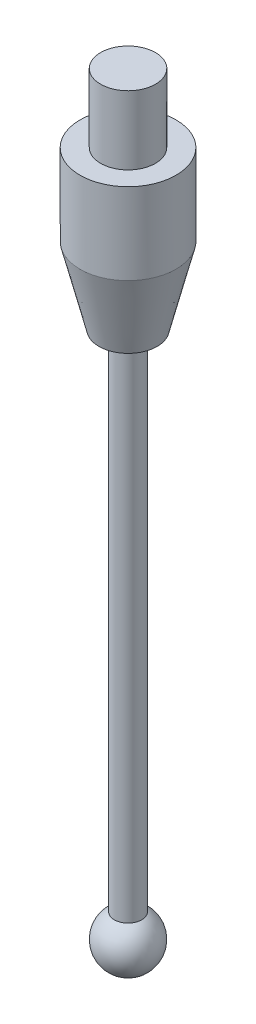
ISO-10303-21;
HEADER;
FILE_DESCRIPTION(('STEP AP214'),'2;1');
FILE_NAME('part.step','',(''),(''),'','','');
FILE_SCHEMA(('AUTOMOTIVE_DESIGN { 1 0 10303 214 1 1 1 1 }'));
ENDSEC;
DATA;
#1=APPLICATION_CONTEXT('core data for automotive mechanical design processes');
#2=APPLICATION_PROTOCOL_DEFINITION('international standard','automotive_design',2000,#1);
#3=PRODUCT_CONTEXT('',#1,'mechanical');
#4=PRODUCT('Part','Part','',(#3));
#5=PRODUCT_RELATED_PRODUCT_CATEGORY('part','',(#4));
#6=PRODUCT_DEFINITION_FORMATION('','',#4);
#7=PRODUCT_DEFINITION_CONTEXT('part definition',#1,'design');
#8=PRODUCT_DEFINITION('design','',#6,#7);
#9=PRODUCT_DEFINITION_SHAPE('','',#8);
#10=(LENGTH_UNIT() NAMED_UNIT(*) SI_UNIT(.MILLI.,.METRE.));
#11=(NAMED_UNIT(*) PLANE_ANGLE_UNIT() SI_UNIT($,.RADIAN.));
#12=(NAMED_UNIT(*) SI_UNIT($,.STERADIAN.) SOLID_ANGLE_UNIT());
#13=UNCERTAINTY_MEASURE_WITH_UNIT(LENGTH_MEASURE(1.E-05),#10,'distance_accuracy_value','');
#14=(GEOMETRIC_REPRESENTATION_CONTEXT(3) GLOBAL_UNCERTAINTY_ASSIGNED_CONTEXT((#13)) GLOBAL_UNIT_ASSIGNED_CONTEXT((#10,
#11,#12)) REPRESENTATION_CONTEXT('',''));
#15=CARTESIAN_POINT('',(0.,0.,0.));
#16=DIRECTION('',(0.,0.,1.));
#17=DIRECTION('',(1.,0.,0.));
#18=AXIS2_PLACEMENT_3D('',#15,#16,#17);
#19=CARTESIAN_POINT('',(0.,0.,0.));
#20=DIRECTION('',(0.,-0.999999999999997,0.));
#21=DIRECTION('',(-1.,0.,0.));
#22=AXIS2_PLACEMENT_3D('',#19,#20,#21);
#23=SPHERICAL_SURFACE('',#22,2.);
#24=CARTESIAN_POINT('',(0.,1.73205080756887,0.));
#25=DIRECTION('',(0.,-0.999999999999997,0.));
#26=DIRECTION('',(0.,0.,-1.));
#27=AXIS2_PLACEMENT_3D('',#24,#25,#26);
#28=CIRCLE('',#27,1.);
#29=CARTESIAN_POINT('',(0.,1.73205080756887,-1.));
#30=VERTEX_POINT('',#29);
#31=EDGE_CURVE('E37',#30,#30,#28,.T.);
#32=ORIENTED_EDGE('',*,*,#31,.T.);
#33=EDGE_LOOP('',(#32));
#34=FACE_BOUND('',#33,.T.);
#35=ADVANCED_FACE('F34',(#34),#23,.T.);
#36=CARTESIAN_POINT('',(0.,-2.,0.));
#37=DIRECTION('',(0.,-0.999999999999997,0.));
#38=DIRECTION('',(0.,0.,-1.));
#39=AXIS2_PLACEMENT_3D('',#36,#37,#38);
#40=CYLINDRICAL_SURFACE('',#39,1.);
#41=CARTESIAN_POINT('',(0.,38.4999999999998,0.));
#42=DIRECTION('',(0.,-0.999999999999997,0.));
#43=DIRECTION('',(0.,0.,-1.));
#44=AXIS2_PLACEMENT_3D('',#41,#42,#43);
#45=CIRCLE('',#44,1.);
#46=CARTESIAN_POINT('',(0.,38.4999999999998,-1.));
#47=VERTEX_POINT('',#46);
#48=EDGE_CURVE('E45',#47,#47,#45,.T.);
#49=CARTESIAN_POINT('',(0.,38.4999999999998,-1.));
#50=CARTESIAN_POINT('',(0.,38.1170005292454,-1.));
#51=CARTESIAN_POINT('',(0.,37.7340010584909,-1.));
#52=CARTESIAN_POINT('',(0.,36.9680021169819,-1.));
#53=CARTESIAN_POINT('',(0.,36.5850026462274,-1.));
#54=CARTESIAN_POINT('',(0.,35.8190037047184,-1.));
#55=CARTESIAN_POINT('',(0.,35.4360042339639,-1.));
#56=CARTESIAN_POINT('',(0.,34.6700052924549,-1.));
#57=CARTESIAN_POINT('',(0.,34.2870058217005,-1.));
#58=CARTESIAN_POINT('',(0.,33.5210068801915,-1.));
#59=CARTESIAN_POINT('',(0.,33.138007409437,-1.));
#60=CARTESIAN_POINT('',(0.,32.372008467928,-1.));
#61=CARTESIAN_POINT('',(0.,31.9890089971735,-1.));
#62=CARTESIAN_POINT('',(0.,31.2230100556645,-1.));
#63=CARTESIAN_POINT('',(0.,30.8400105849101,-1.));
#64=CARTESIAN_POINT('',(0.,30.0740116434011,-1.));
#65=CARTESIAN_POINT('',(0.,29.6910121726466,-1.));
#66=CARTESIAN_POINT('',(0.,28.9250132311376,-1.));
#67=CARTESIAN_POINT('',(0.,28.5420137603831,-1.));
#68=CARTESIAN_POINT('',(0.,27.7760148188741,-1.));
#69=CARTESIAN_POINT('',(0.,27.3930153481197,-1.));
#70=CARTESIAN_POINT('',(0.,26.6270164066107,-1.));
#71=CARTESIAN_POINT('',(0.,26.2440169358562,-1.));
#72=CARTESIAN_POINT('',(0.,25.4780179943472,-1.));
#73=CARTESIAN_POINT('',(0.,25.0950185235927,-1.));
#74=CARTESIAN_POINT('',(0.,24.3290195820837,-1.));
#75=CARTESIAN_POINT('',(0.,23.9460201113293,-1.));
#76=CARTESIAN_POINT('',(0.,23.1800211698203,-1.));
#77=CARTESIAN_POINT('',(0.,22.7970216990658,-1.));
#78=CARTESIAN_POINT('',(0.,22.0310227575568,-1.));
#79=CARTESIAN_POINT('',(0.,21.6480232868023,-1.));
#80=CARTESIAN_POINT('',(0.,20.8820243452933,-1.));
#81=CARTESIAN_POINT('',(0.,20.4990248745388,-1.));
#82=CARTESIAN_POINT('',(0.,19.7330259330299,-1.));
#83=CARTESIAN_POINT('',(0.,19.3500264622754,-1.));
#84=CARTESIAN_POINT('',(0.,18.5840275207664,-1.));
#85=CARTESIAN_POINT('',(0.,18.2010280500119,-1.));
#86=CARTESIAN_POINT('',(0.,17.4350291085029,-1.));
#87=CARTESIAN_POINT('',(0.,17.0520296377484,-1.));
#88=CARTESIAN_POINT('',(0.,16.2860306962395,-1.));
#89=CARTESIAN_POINT('',(0.,15.903031225485,-1.));
#90=CARTESIAN_POINT('',(0.,15.137032283976,-1.));
#91=CARTESIAN_POINT('',(0.,14.7540328132215,-1.));
#92=CARTESIAN_POINT('',(0.,13.9880338717125,-1.));
#93=CARTESIAN_POINT('',(0.,13.605034400958,-1.));
#94=CARTESIAN_POINT('',(0.,12.8390354594491,-1.));
#95=CARTESIAN_POINT('',(0.,12.4560359886946,-1.));
#96=CARTESIAN_POINT('',(0.,11.6900370471856,-1.));
#97=CARTESIAN_POINT('',(0.,11.3070375764311,-1.));
#98=CARTESIAN_POINT('',(0.,10.5410386349221,-1.));
#99=CARTESIAN_POINT('',(0.,10.1580391641676,-1.));
#100=CARTESIAN_POINT('',(0.,9.39204022265866,-1.));
#101=CARTESIAN_POINT('',(0.,9.00904075190417,-1.));
#102=CARTESIAN_POINT('',(0.,8.24304181039519,-1.));
#103=CARTESIAN_POINT('',(0.,7.8600423396407,-1.));
#104=CARTESIAN_POINT('',(0.,7.09404339813173,-1.));
#105=CARTESIAN_POINT('',(0.,6.71104392737724,-1.));
#106=CARTESIAN_POINT('',(0.,5.94504498586826,-1.));
#107=CARTESIAN_POINT('',(0.,5.56204551511377,-1.));
#108=CARTESIAN_POINT('',(0.,4.79604657360479,-1.));
#109=CARTESIAN_POINT('',(0.,4.4130471028503,-1.));
#110=CARTESIAN_POINT('',(0.,3.64704816134132,-1.));
#111=CARTESIAN_POINT('',(0.,3.26404869058683,-1.));
#112=CARTESIAN_POINT('',(0.,2.49804974907785,-1.));
#113=CARTESIAN_POINT('',(0.,2.11505027832337,-1.));
#114=CARTESIAN_POINT('',(0.,1.73205080756888,-1.));
#115=B_SPLINE_CURVE_WITH_KNOTS('',3,(#49,#50,#51,#52,#53,#54,#55,#56,#57,#58,#59,#60,#61,#62,
#63,#64,#65,#66,#67,#68,#69,#70,#71,#72,#73,#74,#75,#76,#77,#78,#79,#80,#81,#82,#83,#84,#85,#86,
#87,#88,#89,#90,#91,#92,#93,#94,#95,#96,#97,#98,#99,#100,#101,#102,#103,#104,#105,#106,#107,
#108,#109,#110,#111,#112,#113,#114),.UNSPECIFIED.,.F.,.F.,(4,2,2,2,2,2,2,2,2,2,2,2,2,2,2,2,2,2,
2,2,2,2,2,2,2,2,2,2,2,2,2,2,4),(0.,1.14899841226346,2.29799682452694,3.4469952367904,
4.59599364905387,5.74499206131733,6.8939904735808,8.04298888584427,9.19198729810774,
10.3409857103712,11.4899841226347,12.6389825348981,13.7879809471616,14.9369793594251,
16.0859777716885,17.234976183952,18.3839745962155,19.5329730084789,20.6819714207424,
21.8309698330059,22.9799682452694,24.1289666575328,25.2779650697963,26.4269634820598,
27.5759618943232,28.7249603065867,29.8739587188502,31.0229571311136,32.1719555433771,
33.3209539556406,34.469952367904,35.6189507801675,36.767949192431),.UNSPECIFIED.);
#116=EDGE_CURVE('BSEAM60',#47,#30,#115,.T.);
#117=ORIENTED_EDGE('',*,*,#48,.T.);
#118=ORIENTED_EDGE('',*,*,#31,.F.);
#119=ORIENTED_EDGE('',*,*,#116,.T.);
#120=ORIENTED_EDGE('',*,*,#116,.F.);
#121=EDGE_LOOP('',(#117,#119,#118,#120));
#122=FACE_BOUND('',#121,.T.);
#123=ADVANCED_FACE('F60',(#122),#40,.T.);
#124=CARTESIAN_POINT('',(0.999999999999973,38.4999999999998,0.));
#125=DIRECTION('',(0.,-0.999999999999997,0.));
#126=DIRECTION('',(0.,0.,-1.));
#127=AXIS2_PLACEMENT_3D('',#124,#125,#126);
#128=PLANE('',#127);
#129=CARTESIAN_POINT('',(0.,38.4999999999998,0.));
#130=DIRECTION('',(0.,-0.999999999999997,0.));
#131=DIRECTION('',(0.,0.,-1.));
#132=AXIS2_PLACEMENT_3D('',#129,#130,#131);
#133=CIRCLE('',#132,2.12306620697034);
#134=CARTESIAN_POINT('',(0.,38.4999999999998,2.12306620697034));
#135=VERTEX_POINT('',#134);
#136=EDGE_CURVE('E55',#135,#135,#133,.T.);
#137=ORIENTED_EDGE('',*,*,#136,.T.);
#138=EDGE_LOOP('',(#137));
#139=FACE_BOUND('',#138,.T.);
#140=ORIENTED_EDGE('',*,*,#48,.F.);
#141=EDGE_LOOP('',(#140));
#142=FACE_BOUND('',#141,.T.);
#143=ADVANCED_FACE('F63',(#139,#142),#128,.T.);
#144=CARTESIAN_POINT('',(0.,38.4999999999998,0.));
#145=DIRECTION('',(0.,0.999999999999997,0.));
#146=DIRECTION('',(0.,0.,1.));
#147=AXIS2_PLACEMENT_3D('',#144,#145,#146);
#148=CONICAL_SURFACE('',#147,2.12306620697034,0.242405612510473);
#149=CARTESIAN_POINT('',(0.,44.0685912958292,0.));
#150=DIRECTION('',(0.,-0.999999999999997,0.));
#151=DIRECTION('',(0.,0.,-1.));
#152=AXIS2_PLACEMENT_3D('',#149,#150,#151);
#153=CIRCLE('',#152,3.5);
#154=CARTESIAN_POINT('',(0.,44.0685912958292,3.50000000000001));
#155=VERTEX_POINT('',#154);
#156=EDGE_CURVE('E52',#155,#155,#153,.T.);
#157=CARTESIAN_POINT('',(0.,44.0685912958292,3.50000000000001));
#158=CARTESIAN_POINT('',(0.,44.0105851364977,3.48565693965595));
#159=CARTESIAN_POINT('',(0.,43.9525789771661,3.47131387931189));
#160=CARTESIAN_POINT('',(0.,43.836566658503,3.44262775862377));
#161=CARTESIAN_POINT('',(0.,43.7785604991714,3.42828469827971));
#162=CARTESIAN_POINT('',(0.,43.6625481805083,3.3995985775916));
#163=CARTESIAN_POINT('',(0.,43.6045420211768,3.38525551724754));
#164=CARTESIAN_POINT('',(0.,43.4885297025137,3.35656939655942));
#165=CARTESIAN_POINT('',(0.,43.4305235431821,3.34222633621536));
#166=CARTESIAN_POINT('',(0.,43.314511224519,3.31354021552724));
#167=CARTESIAN_POINT('',(0.,43.2565050651874,3.29919715518318));
#168=CARTESIAN_POINT('',(0.,43.1404927465243,3.27051103449507));
#169=CARTESIAN_POINT('',(0.,43.0824865871928,3.25616797415101));
#170=CARTESIAN_POINT('',(0.,42.9664742685297,3.22748185346289));
#171=CARTESIAN_POINT('',(0.,42.9084681091981,3.21313879311883));
#172=CARTESIAN_POINT('',(0.,42.792455790535,3.18445267243071));
#173=CARTESIAN_POINT('',(0.,42.7344496312034,3.17010961208665));
#174=CARTESIAN_POINT('',(0.,42.6184373125403,3.14142349139853));
#175=CARTESIAN_POINT('',(0.,42.5604311532088,3.12708043105447));
#176=CARTESIAN_POINT('',(0.,42.4444188345457,3.09839431036636));
#177=CARTESIAN_POINT('',(0.,42.3864126752141,3.0840512500223));
#178=CARTESIAN_POINT('',(0.,42.270400356551,3.05536512933418));
#179=CARTESIAN_POINT('',(0.,42.2123941972194,3.04102206899012));
#180=CARTESIAN_POINT('',(0.,42.0963818785563,3.012335948302));
#181=CARTESIAN_POINT('',(0.,42.0383757192248,2.99799288795794));
#182=CARTESIAN_POINT('',(0.,41.9223634005617,2.96930676726983));
#183=CARTESIAN_POINT('',(0.,41.8643572412301,2.95496370692577));
#184=CARTESIAN_POINT('',(0.,41.748344922567,2.92627758623765));
#185=CARTESIAN_POINT('',(0.,41.6903387632354,2.91193452589359));
#186=CARTESIAN_POINT('',(0.,41.5743264445723,2.88324840520547));
#187=CARTESIAN_POINT('',(0.,41.5163202852408,2.86890534486141));
#188=CARTESIAN_POINT('',(0.,41.4003079665776,2.84021922417329));
#189=CARTESIAN_POINT('',(0.,41.3423018072461,2.82587616382923));
#190=CARTESIAN_POINT('',(0.,41.226289488583,2.79719004314112));
#191=CARTESIAN_POINT('',(0.,41.1682833292514,2.78284698279706));
#192=CARTESIAN_POINT('',(0.,41.0522710105883,2.75416086210894));
#193=CARTESIAN_POINT('',(0.,40.9942648512568,2.73981780176488));
#194=CARTESIAN_POINT('',(0.,40.8782525325936,2.71113168107676));
#195=CARTESIAN_POINT('',(0.,40.8202463732621,2.6967886207327));
#196=CARTESIAN_POINT('',(0.,40.704234054599,2.66810250004458));
#197=CARTESIAN_POINT('',(0.,40.6462278952674,2.65375943970053));
#198=CARTESIAN_POINT('',(0.,40.5302155766043,2.62507331901241));
#199=CARTESIAN_POINT('',(0.,40.4722094172727,2.61073025866835));
#200=CARTESIAN_POINT('',(0.,40.3561970986096,2.58204413798023));
#201=CARTESIAN_POINT('',(0.,40.2981909392781,2.56770107763617));
#202=CARTESIAN_POINT('',(0.,40.182178620615,2.53901495694805));
#203=CARTESIAN_POINT('',(0.,40.1241724612834,2.52467189660399));
#204=CARTESIAN_POINT('',(0.,40.0081601426203,2.49598577591588));
#205=CARTESIAN_POINT('',(0.,39.9501539832887,2.48164271557182));
#206=CARTESIAN_POINT('',(0.,39.8341416646256,2.4529565948837));
#207=CARTESIAN_POINT('',(0.,39.7761355052941,2.43861353453964));
#208=CARTESIAN_POINT('',(0.,39.660123186631,2.40992741385152));
#209=CARTESIAN_POINT('',(0.,39.6021170272994,2.39558435350746));
#210=CARTESIAN_POINT('',(0.,39.4861047086363,2.36689823281934));
#211=CARTESIAN_POINT('',(0.,39.4280985493047,2.35255517247528));
#212=CARTESIAN_POINT('',(0.,39.3120862306416,2.32386905178717));
#213=CARTESIAN_POINT('',(0.,39.2540800713101,2.30952599144311));
#214=CARTESIAN_POINT('',(0.,39.138067752647,2.28083987075499));
#215=CARTESIAN_POINT('',(0.,39.0800615933154,2.26649681041093));
#216=CARTESIAN_POINT('',(0.,38.9640492746523,2.23781068972281));
#217=CARTESIAN_POINT('',(0.,38.9060431153207,2.22346762937875));
#218=CARTESIAN_POINT('',(0.,38.7900307966576,2.19478150869064));
#219=CARTESIAN_POINT('',(0.,38.7320246373261,2.18043844834658));
#220=CARTESIAN_POINT('',(0.,38.6160123186629,2.15175232765846));
#221=CARTESIAN_POINT('',(0.,38.5580061593314,2.1374092673144));
#222=CARTESIAN_POINT('',(0.,38.4999999999998,2.12306620697034));
#223=B_SPLINE_CURVE_WITH_KNOTS('',3,(#157,#158,#159,#160,#161,#162,#163,#164,#165,#166,#167,
#168,#169,#170,#171,#172,#173,#174,#175,#176,#177,#178,#179,#180,#181,#182,#183,#184,#185,#186,
#187,#188,#189,#190,#191,#192,#193,#194,#195,#196,#197,#198,#199,#200,#201,#202,#203,#204,#205,
#206,#207,#208,#209,#210,#211,#212,#213,#214,#215,#216,#217,#218,#219,#220,#221,#222),
.UNSPECIFIED.,.F.,.F.,(4,2,2,2,2,2,2,2,2,2,2,2,2,2,2,2,2,2,2,2,2,2,2,2,2,2,2,2,2,2,2,2,4),(0.,
0.179259424030869,0.358518848061744,0.53777827209262,0.717037696123495,0.89629712015437,
1.07555654418525,1.25481596821611,1.43407539224699,1.61333481627787,1.79259424030874,
1.97185366433961,2.15111308837049,2.33037251240136,2.50963193643224,2.68889136046311,
2.86815078449399,3.04741020852485,3.22666963255573,3.40592905658661,3.58518848061748,
3.76444790464836,3.94370732867922,4.1229667527101,4.30222617674098,4.48148560077185,
4.66074502480273,4.8400044488336,5.01926387286447,5.19852329689535,5.37778272092622,
5.5570421449571,5.73630156898797),.UNSPECIFIED.);
#224=EDGE_CURVE('BSEAM65',#155,#135,#223,.T.);
#225=ORIENTED_EDGE('',*,*,#156,.T.);
#226=ORIENTED_EDGE('',*,*,#136,.F.);
#227=ORIENTED_EDGE('',*,*,#224,.T.);
#228=ORIENTED_EDGE('',*,*,#224,.F.);
#229=EDGE_LOOP('',(#225,#227,#226,#228));
#230=FACE_BOUND('',#229,.T.);
#231=ADVANCED_FACE('F65',(#230),#148,.T.);
#232=CARTESIAN_POINT('',(0.,-2.,0.));
#233=DIRECTION('',(0.,-0.999999999999997,0.));
#234=DIRECTION('',(0.,0.,-1.));
#235=AXIS2_PLACEMENT_3D('',#232,#233,#234);
#236=CYLINDRICAL_SURFACE('',#235,3.5);
#237=CARTESIAN_POINT('',(0.,49.9999999999997,0.));
#238=DIRECTION('',(0.,-0.999999999999997,0.));
#239=DIRECTION('',(0.,0.,-1.));
#240=AXIS2_PLACEMENT_3D('',#237,#238,#239);
#241=CIRCLE('',#240,3.5);
#242=CARTESIAN_POINT('',(0.,49.9999999999997,-3.50000000000001));
#243=VERTEX_POINT('',#242);
#244=EDGE_CURVE('E49',#243,#243,#241,.T.);
#245=ORIENTED_EDGE('',*,*,#244,.T.);
#246=EDGE_LOOP('',(#245));
#247=FACE_BOUND('',#246,.T.);
#248=ORIENTED_EDGE('',*,*,#156,.F.);
#249=EDGE_LOOP('',(#248));
#250=FACE_BOUND('',#249,.T.);
#251=ADVANCED_FACE('F72',(#247,#250),#236,.T.);
#252=CARTESIAN_POINT('',(3.50000000000003,49.9999999999997,0.));
#253=DIRECTION('',(0.,0.999999999999997,0.));
#254=DIRECTION('',(0.,0.,1.));
#255=AXIS2_PLACEMENT_3D('',#252,#253,#254);
#256=PLANE('',#255);
#257=CARTESIAN_POINT('',(0.,49.9999999999997,0.));
#258=DIRECTION('',(0.,0.999999999999997,0.));
#259=DIRECTION('',(0.,0.,1.));
#260=AXIS2_PLACEMENT_3D('',#257,#258,#259);
#261=CIRCLE('',#260,2.);
#262=CARTESIAN_POINT('',(0.,49.9999999999997,-2.));
#263=VERTEX_POINT('',#262);
#264=EDGE_CURVE('E10',#263,#263,#261,.T.);
#265=ORIENTED_EDGE('',*,*,#264,.F.);
#266=EDGE_LOOP('',(#265));
#267=FACE_BOUND('',#266,.T.);
#268=ORIENTED_EDGE('',*,*,#244,.F.);
#269=EDGE_LOOP('',(#268));
#270=FACE_BOUND('',#269,.T.);
#271=ADVANCED_FACE('F99',(#267,#270),#256,.T.);
#272=CARTESIAN_POINT('',(0.,54.9999999999997,0.));
#273=DIRECTION('',(0.,-0.999999999999997,0.));
#274=DIRECTION('',(0.,0.,-1.));
#275=AXIS2_PLACEMENT_3D('',#272,#273,#274);
#276=CYLINDRICAL_SURFACE('',#275,2.);
#277=CARTESIAN_POINT('',(0.,54.9999999999997,0.));
#278=DIRECTION('',(0.,0.999999999999997,0.));
#279=DIRECTION('',(0.,0.,1.));
#280=AXIS2_PLACEMENT_3D('',#277,#278,#279);
#281=CIRCLE('',#280,2.);
#282=CARTESIAN_POINT('',(0.,54.9999999999997,-2.));
#283=VERTEX_POINT('',#282);
#284=EDGE_CURVE('E48',#283,#283,#281,.T.);
#285=CARTESIAN_POINT('',(0.,54.9999999999997,-2.));
#286=CARTESIAN_POINT('',(0.,54.9479166666664,-2.));
#287=CARTESIAN_POINT('',(0.,54.8958333333331,-2.));
#288=CARTESIAN_POINT('',(0.,54.7916666666664,-2.));
#289=CARTESIAN_POINT('',(0.,54.7395833333331,-2.));
#290=CARTESIAN_POINT('',(0.,54.6354166666664,-2.));
#291=CARTESIAN_POINT('',(0.,54.5833333333331,-2.));
#292=CARTESIAN_POINT('',(0.,54.4791666666664,-2.));
#293=CARTESIAN_POINT('',(0.,54.4270833333331,-2.));
#294=CARTESIAN_POINT('',(0.,54.3229166666664,-2.));
#295=CARTESIAN_POINT('',(0.,54.2708333333331,-2.));
#296=CARTESIAN_POINT('',(0.,54.1666666666664,-2.));
#297=CARTESIAN_POINT('',(0.,54.1145833333331,-2.));
#298=CARTESIAN_POINT('',(0.,54.0104166666664,-2.));
#299=CARTESIAN_POINT('',(0.,53.9583333333331,-2.));
#300=CARTESIAN_POINT('',(0.,53.8541666666664,-2.));
#301=CARTESIAN_POINT('',(0.,53.8020833333331,-2.));
#302=CARTESIAN_POINT('',(0.,53.6979166666664,-2.));
#303=CARTESIAN_POINT('',(0.,53.6458333333331,-2.));
#304=CARTESIAN_POINT('',(0.,53.5416666666664,-2.));
#305=CARTESIAN_POINT('',(0.,53.4895833333331,-2.));
#306=CARTESIAN_POINT('',(0.,53.3854166666664,-2.));
#307=CARTESIAN_POINT('',(0.,53.3333333333331,-2.));
#308=CARTESIAN_POINT('',(0.,53.2291666666664,-2.));
#309=CARTESIAN_POINT('',(0.,53.1770833333331,-2.));
#310=CARTESIAN_POINT('',(0.,53.0729166666664,-2.));
#311=CARTESIAN_POINT('',(0.,53.0208333333331,-2.));
#312=CARTESIAN_POINT('',(0.,52.9166666666664,-2.));
#313=CARTESIAN_POINT('',(0.,52.8645833333331,-2.));
#314=CARTESIAN_POINT('',(0.,52.7604166666664,-2.));
#315=CARTESIAN_POINT('',(0.,52.7083333333331,-2.));
#316=CARTESIAN_POINT('',(0.,52.6041666666664,-2.));
#317=CARTESIAN_POINT('',(0.,52.5520833333331,-2.));
#318=CARTESIAN_POINT('',(0.,52.4479166666664,-2.));
#319=CARTESIAN_POINT('',(0.,52.3958333333331,-2.));
#320=CARTESIAN_POINT('',(0.,52.2916666666664,-2.));
#321=CARTESIAN_POINT('',(0.,52.2395833333331,-2.));
#322=CARTESIAN_POINT('',(0.,52.1354166666664,-2.));
#323=CARTESIAN_POINT('',(0.,52.0833333333331,-2.));
#324=CARTESIAN_POINT('',(0.,51.9791666666664,-2.));
#325=CARTESIAN_POINT('',(0.,51.9270833333331,-2.));
#326=CARTESIAN_POINT('',(0.,51.8229166666664,-2.));
#327=CARTESIAN_POINT('',(0.,51.7708333333331,-2.));
#328=CARTESIAN_POINT('',(0.,51.6666666666664,-2.));
#329=CARTESIAN_POINT('',(0.,51.6145833333331,-2.));
#330=CARTESIAN_POINT('',(0.,51.5104166666664,-2.));
#331=CARTESIAN_POINT('',(0.,51.4583333333331,-2.));
#332=CARTESIAN_POINT('',(0.,51.3541666666664,-2.));
#333=CARTESIAN_POINT('',(0.,51.3020833333331,-2.));
#334=CARTESIAN_POINT('',(0.,51.1979166666664,-2.));
#335=CARTESIAN_POINT('',(0.,51.1458333333331,-2.));
#336=CARTESIAN_POINT('',(0.,51.0416666666664,-2.));
#337=CARTESIAN_POINT('',(0.,50.9895833333331,-2.));
#338=CARTESIAN_POINT('',(0.,50.8854166666664,-2.));
#339=CARTESIAN_POINT('',(0.,50.8333333333331,-2.));
#340=CARTESIAN_POINT('',(0.,50.7291666666664,-2.));
#341=CARTESIAN_POINT('',(0.,50.6770833333331,-2.));
#342=CARTESIAN_POINT('',(0.,50.5729166666664,-2.));
#343=CARTESIAN_POINT('',(0.,50.5208333333331,-2.));
#344=CARTESIAN_POINT('',(0.,50.4166666666664,-2.));
#345=CARTESIAN_POINT('',(0.,50.3645833333331,-2.));
#346=CARTESIAN_POINT('',(0.,50.2604166666664,-2.));
#347=CARTESIAN_POINT('',(0.,50.2083333333331,-2.));
#348=CARTESIAN_POINT('',(0.,50.1041666666664,-2.));
#349=CARTESIAN_POINT('',(0.,50.0520833333331,-2.));
#350=CARTESIAN_POINT('',(0.,49.9999999999997,-2.));
#351=B_SPLINE_CURVE_WITH_KNOTS('',3,(#285,#286,#287,#288,#289,#290,#291,#292,#293,#294,#295,
#296,#297,#298,#299,#300,#301,#302,#303,#304,#305,#306,#307,#308,#309,#310,#311,#312,#313,#314,
#315,#316,#317,#318,#319,#320,#321,#322,#323,#324,#325,#326,#327,#328,#329,#330,#331,#332,#333,
#334,#335,#336,#337,#338,#339,#340,#341,#342,#343,#344,#345,#346,#347,#348,#349,#350),
.UNSPECIFIED.,.F.,.F.,(4,2,2,2,2,2,2,2,2,2,2,2,2,2,2,2,2,2,2,2,2,2,2,2,2,2,2,2,2,2,2,2,4),(0.,
0.156250000000004,0.3125,0.468750000000004,0.625000000000001,0.781250000000004,
0.937500000000001,1.09375,1.25,1.40625,1.5625,1.71875,1.875,2.03125000000001,2.1875,
2.34375000000001,2.5,2.65625000000001,2.8125,2.96875000000001,3.125,3.28125000000001,3.4375,
3.59375000000001,3.75,3.90625000000001,4.0625,4.21875000000001,4.375,4.53125000000001,4.6875,
4.84375000000001,5.),.UNSPECIFIED.);
#352=EDGE_CURVE('BSEAM107',#283,#263,#351,.T.);
#353=ORIENTED_EDGE('',*,*,#284,.F.);
#354=ORIENTED_EDGE('',*,*,#264,.T.);
#355=ORIENTED_EDGE('',*,*,#352,.T.);
#356=ORIENTED_EDGE('',*,*,#352,.F.);
#357=EDGE_LOOP('',(#353,#355,#354,#356));
#358=FACE_BOUND('',#357,.T.);
#359=ADVANCED_FACE('F107',(#358),#276,.T.);
#360=CARTESIAN_POINT('',(0.,54.9999999999997,0.));
#361=DIRECTION('',(0.,0.999999999999997,0.));
#362=DIRECTION('',(0.,0.,1.));
#363=AXIS2_PLACEMENT_3D('',#360,#361,#362);
#364=PLANE('',#363);
#365=ORIENTED_EDGE('',*,*,#284,.T.);
#366=EDGE_LOOP('',(#365));
#367=FACE_BOUND('',#366,.T.);
#368=ADVANCED_FACE('F115',(#367),#364,.T.);
#369=CLOSED_SHELL('',(#35,#123,#143,#231,#251,#271,#359,#368));
#370=MANIFOLD_SOLID_BREP('B2',#369);
#371=ADVANCED_BREP_SHAPE_REPRESENTATION('',(#18,#370),#14);
#372=SHAPE_DEFINITION_REPRESENTATION(#9,#371);
ENDSEC;
END-ISO-10303-21;
